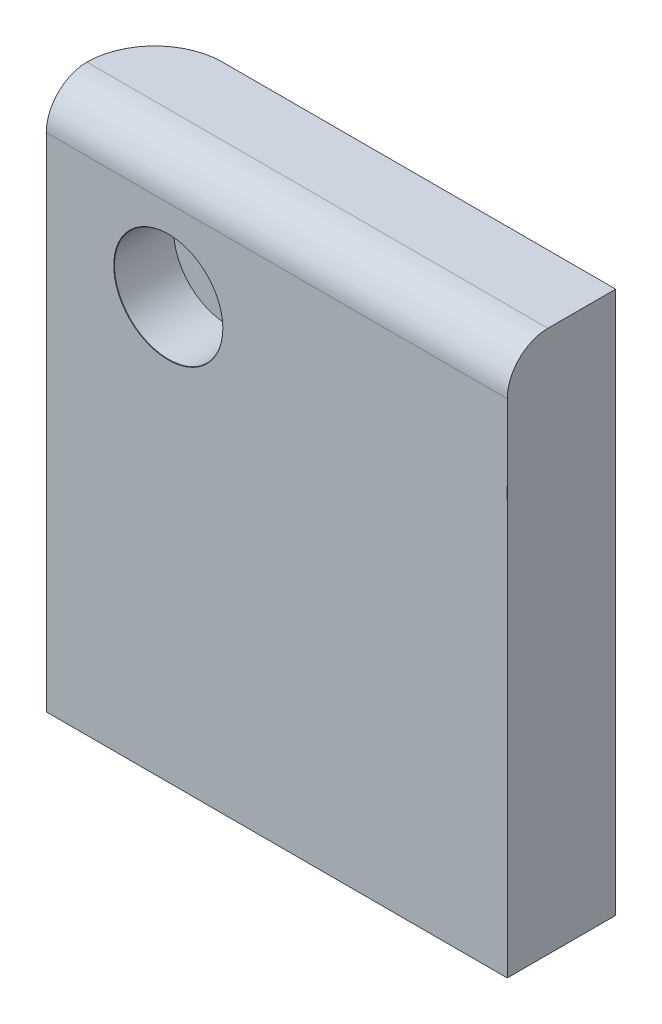
ISO-10303-21;
HEADER;
FILE_DESCRIPTION(('STEP AP214'),'2;1');
FILE_NAME('part.step','',(''),(''),'','','');
FILE_SCHEMA(('AUTOMOTIVE_DESIGN { 1 0 10303 214 1 1 1 1 }'));
ENDSEC;
DATA;
#1=APPLICATION_CONTEXT('core data for automotive mechanical design processes');
#2=APPLICATION_PROTOCOL_DEFINITION('international standard','automotive_design',2000,#1);
#3=PRODUCT_CONTEXT('',#1,'mechanical');
#4=PRODUCT('Part','Part','',(#3));
#5=PRODUCT_RELATED_PRODUCT_CATEGORY('part','',(#4));
#6=PRODUCT_DEFINITION_FORMATION('','',#4);
#7=PRODUCT_DEFINITION_CONTEXT('part definition',#1,'design');
#8=PRODUCT_DEFINITION('design','',#6,#7);
#9=PRODUCT_DEFINITION_SHAPE('','',#8);
#10=(LENGTH_UNIT() NAMED_UNIT(*) SI_UNIT(.MILLI.,.METRE.));
#11=(NAMED_UNIT(*) PLANE_ANGLE_UNIT() SI_UNIT($,.RADIAN.));
#12=(NAMED_UNIT(*) SI_UNIT($,.STERADIAN.) SOLID_ANGLE_UNIT());
#13=UNCERTAINTY_MEASURE_WITH_UNIT(LENGTH_MEASURE(1.E-05),#10,'distance_accuracy_value','');
#14=(GEOMETRIC_REPRESENTATION_CONTEXT(3) GLOBAL_UNCERTAINTY_ASSIGNED_CONTEXT((#13)) GLOBAL_UNIT_ASSIGNED_CONTEXT((#10,
#11,#12)) REPRESENTATION_CONTEXT('',''));
#15=CARTESIAN_POINT('',(0.,0.,0.));
#16=DIRECTION('',(0.,0.,1.));
#17=DIRECTION('',(1.,0.,0.));
#18=AXIS2_PLACEMENT_3D('',#15,#16,#17);
#19=CARTESIAN_POINT('',(-23.5,-40.,4.));
#20=DIRECTION('',(0.,0.,1.));
#21=DIRECTION('',(1.,0.,0.));
#22=AXIS2_PLACEMENT_3D('',#19,#20,#21);
#23=PLANE('',#22);
#24=DIRECTION('',(0.,-1.,0.));
#25=VECTOR('',#24,1.);
#26=CARTESIAN_POINT('',(10.5,-40.,4.));
#27=LINE('',#26,#25);
#28=CARTESIAN_POINT('',(10.5,-3.,4.));
#29=VERTEX_POINT('',#28);
#30=CARTESIAN_POINT('',(10.5,-8.55208817832078,4.));
#31=VERTEX_POINT('',#30);
#32=EDGE_CURVE('E62',#29,#31,#27,.T.);
#33=ORIENTED_EDGE('',*,*,#32,.F.);
#34=DIRECTION('',(1.,0.,0.));
#35=VECTOR('',#34,1.);
#36=CARTESIAN_POINT('',(-23.5,-3.,4.));
#37=LINE('',#36,#35);
#38=CARTESIAN_POINT('',(-23.5,-3.,4.));
#39=VERTEX_POINT('',#38);
#40=EDGE_CURVE('E137',#29,#39,#37,.F.);
#41=ORIENTED_EDGE('',*,*,#40,.T.);
#42=DIRECTION('',(0.,1.,0.));
#43=VECTOR('',#42,1.);
#44=CARTESIAN_POINT('',(-23.5,-40.,4.));
#45=LINE('',#44,#43);
#46=CARTESIAN_POINT('',(-23.5,-40.,4.));
#47=VERTEX_POINT('',#46);
#48=EDGE_CURVE('E124',#47,#39,#45,.T.);
#49=ORIENTED_EDGE('',*,*,#48,.F.);
#50=DIRECTION('',(1.,0.,0.));
#51=VECTOR('',#50,1.);
#52=CARTESIAN_POINT('',(-23.5,-40.,4.));
#53=LINE('',#52,#51);
#54=CARTESIAN_POINT('',(10.5,-40.,4.));
#55=VERTEX_POINT('',#54);
#56=EDGE_CURVE('E115',#47,#55,#53,.T.);
#57=ORIENTED_EDGE('',*,*,#56,.T.);
#58=CARTESIAN_POINT('',(10.5,-9.44791182167922,4.));
#59=VERTEX_POINT('',#58);
#60=EDGE_CURVE('E101',#59,#55,#27,.T.);
#61=ORIENTED_EDGE('',*,*,#60,.F.);
#62=CARTESIAN_POINT('',(14.5,-9.,4.));
#63=DIRECTION('',(0.,0.,1.));
#64=DIRECTION('',(1.,0.,0.));
#65=AXIS2_PLACEMENT_3D('',#62,#63,#64);
#66=CIRCLE('',#65,4.025);
#67=EDGE_CURVE('E133',#31,#59,#66,.T.);
#68=ORIENTED_EDGE('',*,*,#67,.F.);
#69=EDGE_LOOP('',(#33,#41,#49,#57,#61,#68));
#70=FACE_BOUND('',#69,.T.);
#71=CARTESIAN_POINT('',(-14.5,-9.,4.));
#72=DIRECTION('',(0.,0.,1.));
#73=DIRECTION('',(1.,0.,0.));
#74=AXIS2_PLACEMENT_3D('',#71,#72,#73);
#75=CIRCLE('',#74,4.025);
#76=CARTESIAN_POINT('',(-10.475,-9.,4.));
#77=VERTEX_POINT('',#76);
#78=EDGE_CURVE('E168',#77,#77,#75,.T.);
#79=ORIENTED_EDGE('',*,*,#78,.F.);
#80=EDGE_LOOP('',(#79));
#81=FACE_BOUND('',#80,.T.);
#82=ADVANCED_FACE('F41',(#70,#81),#23,.T.);
#83=CARTESIAN_POINT('',(-23.5,-40.,4.));
#84=DIRECTION('',(-1.,0.,0.));
#85=DIRECTION('',(0.,0.,1.));
#86=AXIS2_PLACEMENT_3D('',#83,#84,#85);
#87=PLANE('',#86);
#88=CARTESIAN_POINT('',(-23.5,-3.,0.999999999999999));
#89=DIRECTION('',(-1.,0.,0.));
#90=DIRECTION('',(0.,0.,1.));
#91=AXIS2_PLACEMENT_3D('',#88,#89,#90);
#92=CIRCLE('',#91,3.);
#93=CARTESIAN_POINT('',(-23.5,0.,0.999999999999999));
#94=VERTEX_POINT('',#93);
#95=EDGE_CURVE('E139',#39,#94,#92,.T.);
#96=ORIENTED_EDGE('',*,*,#95,.T.);
#97=DIRECTION('',(0.,1.,0.));
#98=VECTOR('',#97,1.);
#99=CARTESIAN_POINT('',(-23.5,-40.,0.999999999999999));
#100=LINE('',#99,#98);
#101=CARTESIAN_POINT('',(-23.5,-40.,0.999999999999999));
#102=VERTEX_POINT('',#101);
#103=EDGE_CURVE('E69',#94,#102,#100,.F.);
#104=ORIENTED_EDGE('',*,*,#103,.T.);
#105=DIRECTION('',(0.,0.,1.));
#106=VECTOR('',#105,1.);
#107=CARTESIAN_POINT('',(-23.5,-40.,4.));
#108=LINE('',#107,#106);
#109=EDGE_CURVE('E125',#102,#47,#108,.T.);
#110=ORIENTED_EDGE('',*,*,#109,.T.);
#111=ORIENTED_EDGE('',*,*,#48,.T.);
#112=EDGE_LOOP('',(#96,#104,#110,#111));
#113=FACE_BOUND('',#112,.T.);
#114=ADVANCED_FACE('F181',(#113),#87,.T.);
#115=CARTESIAN_POINT('',(-23.5,-40.,-4.));
#116=DIRECTION('',(0.,0.,-1.));
#117=DIRECTION('',(-1.,0.,0.));
#118=AXIS2_PLACEMENT_3D('',#115,#116,#117);
#119=PLANE('',#118);
#120=DIRECTION('',(0.,-1.,0.));
#121=VECTOR('',#120,1.);
#122=CARTESIAN_POINT('',(10.5,-40.,-4.));
#123=LINE('',#122,#121);
#124=CARTESIAN_POINT('',(10.5,0.,-4.));
#125=VERTEX_POINT('',#124);
#126=CARTESIAN_POINT('',(10.5,-40.,-4.));
#127=VERTEX_POINT('',#126);
#128=EDGE_CURVE('E119',#125,#127,#123,.T.);
#129=ORIENTED_EDGE('',*,*,#128,.T.);
#130=DIRECTION('',(-1.,0.,0.));
#131=VECTOR('',#130,1.);
#132=CARTESIAN_POINT('',(-23.5,-40.,-4.));
#133=LINE('',#132,#131);
#134=CARTESIAN_POINT('',(-18.5,-40.,-4.));
#135=VERTEX_POINT('',#134);
#136=EDGE_CURVE('E117',#127,#135,#133,.T.);
#137=ORIENTED_EDGE('',*,*,#136,.T.);
#138=DIRECTION('',(0.,1.,0.));
#139=VECTOR('',#138,1.);
#140=CARTESIAN_POINT('',(-18.5,-40.,-4.));
#141=LINE('',#140,#139);
#142=CARTESIAN_POINT('',(-18.5,0.,-4.));
#143=VERTEX_POINT('',#142);
#144=EDGE_CURVE('E141',#135,#143,#141,.T.);
#145=ORIENTED_EDGE('',*,*,#144,.T.);
#146=DIRECTION('',(-1.,0.,0.));
#147=VECTOR('',#146,1.);
#148=CARTESIAN_POINT('',(-23.5,0.,-4.));
#149=LINE('',#148,#147);
#150=EDGE_CURVE('E132',#125,#143,#149,.T.);
#151=ORIENTED_EDGE('',*,*,#150,.F.);
#152=EDGE_LOOP('',(#129,#137,#145,#151));
#153=FACE_BOUND('',#152,.T.);
#154=CARTESIAN_POINT('',(-14.5,-9.,-4.));
#155=DIRECTION('',(0.,0.,1.));
#156=DIRECTION('',(1.,0.,0.));
#157=AXIS2_PLACEMENT_3D('',#154,#155,#156);
#158=CIRCLE('',#157,2.15);
#159=CARTESIAN_POINT('',(-12.35,-9.,-4.));
#160=VERTEX_POINT('',#159);
#161=EDGE_CURVE('E156',#160,#160,#158,.T.);
#162=ORIENTED_EDGE('',*,*,#161,.T.);
#163=EDGE_LOOP('',(#162));
#164=FACE_BOUND('',#163,.T.);
#165=ADVANCED_FACE('F152',(#153,#164),#119,.T.);
#166=CARTESIAN_POINT('',(0.,-40.,0.));
#167=DIRECTION('',(0.,-1.,0.));
#168=DIRECTION('',(0.,0.,-1.));
#169=AXIS2_PLACEMENT_3D('',#166,#167,#168);
#170=PLANE('',#169);
#171=DIRECTION('',(0.,0.,1.));
#172=VECTOR('',#171,1.);
#173=CARTESIAN_POINT('',(10.5,-40.,-4.001));
#174=LINE('',#173,#172);
#175=EDGE_CURVE('E104',#127,#55,#174,.T.);
#176=ORIENTED_EDGE('',*,*,#175,.T.);
#177=ORIENTED_EDGE('',*,*,#56,.F.);
#178=ORIENTED_EDGE('',*,*,#109,.F.);
#179=CARTESIAN_POINT('',(-18.5,-40.,0.999999999999999));
#180=DIRECTION('',(0.,-1.,0.));
#181=DIRECTION('',(0.,0.,-1.));
#182=AXIS2_PLACEMENT_3D('',#179,#180,#181);
#183=CIRCLE('',#182,5.);
#184=EDGE_CURVE('E55',#102,#135,#183,.T.);
#185=ORIENTED_EDGE('',*,*,#184,.T.);
#186=ORIENTED_EDGE('',*,*,#136,.F.);
#187=EDGE_LOOP('',(#176,#177,#178,#185,#186));
#188=FACE_BOUND('',#187,.T.);
#189=ADVANCED_FACE('F114',(#188),#170,.T.);
#190=CARTESIAN_POINT('',(0.,0.,0.));
#191=DIRECTION('',(0.,-1.,0.));
#192=DIRECTION('',(0.,0.,-1.));
#193=AXIS2_PLACEMENT_3D('',#190,#191,#192);
#194=PLANE('',#193);
#195=DIRECTION('',(1.,0.,0.));
#196=VECTOR('',#195,1.);
#197=CARTESIAN_POINT('',(23.5,0.,0.999999999999999));
#198=LINE('',#197,#196);
#199=CARTESIAN_POINT('',(10.5,0.,0.999999999999999));
#200=VERTEX_POINT('',#199);
#201=EDGE_CURVE('E127',#94,#200,#198,.T.);
#202=ORIENTED_EDGE('',*,*,#201,.T.);
#203=DIRECTION('',(0.,0.,-1.));
#204=VECTOR('',#203,1.);
#205=CARTESIAN_POINT('',(10.5,0.,0.));
#206=LINE('',#205,#204);
#207=EDGE_CURVE('E171',#200,#125,#206,.T.);
#208=ORIENTED_EDGE('',*,*,#207,.T.);
#209=ORIENTED_EDGE('',*,*,#150,.T.);
#210=CARTESIAN_POINT('',(-18.5,0.,0.999999999999999));
#211=DIRECTION('',(0.,-1.,0.));
#212=DIRECTION('',(0.,0.,-1.));
#213=AXIS2_PLACEMENT_3D('',#210,#211,#212);
#214=CIRCLE('',#213,5.);
#215=EDGE_CURVE('E144',#143,#94,#214,.F.);
#216=ORIENTED_EDGE('',*,*,#215,.T.);
#217=EDGE_LOOP('',(#202,#208,#209,#216));
#218=FACE_BOUND('',#217,.T.);
#219=ADVANCED_FACE('F193',(#218),#194,.F.);
#220=CARTESIAN_POINT('',(0.,-3.,0.999999999999999));
#221=DIRECTION('',(-1.,0.,0.));
#222=DIRECTION('',(0.,0.,1.));
#223=AXIS2_PLACEMENT_3D('',#220,#221,#222);
#224=CYLINDRICAL_SURFACE('',#223,3.);
#225=CARTESIAN_POINT('',(10.5,-3.,0.999999999999999));
#226=DIRECTION('',(-1.,0.,0.));
#227=DIRECTION('',(0.,-1.,0.));
#228=AXIS2_PLACEMENT_3D('',#225,#226,#227);
#229=CIRCLE('',#228,3.);
#230=EDGE_CURVE('E118',#200,#29,#229,.F.);
#231=ORIENTED_EDGE('',*,*,#230,.F.);
#232=ORIENTED_EDGE('',*,*,#201,.F.);
#233=ORIENTED_EDGE('',*,*,#95,.F.);
#234=ORIENTED_EDGE('',*,*,#40,.F.);
#235=EDGE_LOOP('',(#231,#232,#233,#234));
#236=FACE_BOUND('',#235,.T.);
#237=ADVANCED_FACE('F180',(#236),#224,.T.);
#238=CARTESIAN_POINT('',(-18.5,-40.,0.999999999999999));
#239=DIRECTION('',(0.,1.,0.));
#240=DIRECTION('',(0.,0.,1.));
#241=AXIS2_PLACEMENT_3D('',#238,#239,#240);
#242=CYLINDRICAL_SURFACE('',#241,5.);
#243=ORIENTED_EDGE('',*,*,#184,.F.);
#244=ORIENTED_EDGE('',*,*,#103,.F.);
#245=ORIENTED_EDGE('',*,*,#215,.F.);
#246=ORIENTED_EDGE('',*,*,#144,.F.);
#247=EDGE_LOOP('',(#243,#244,#245,#246));
#248=FACE_BOUND('',#247,.T.);
#249=ADVANCED_FACE('F43',(#248),#242,.T.);
#250=CARTESIAN_POINT('',(14.5,-9.,4.));
#251=DIRECTION('',(0.,0.,1.));
#252=DIRECTION('',(1.,0.,0.));
#253=AXIS2_PLACEMENT_3D('',#250,#251,#252);
#254=CONICAL_SURFACE('',#253,4.025,0.785398163397431);
#255=ORIENTED_EDGE('',*,*,#67,.T.);
#256=CARTESIAN_POINT('',(10.5,-20.3934802652555,12.0502388197822));
#257=CARTESIAN_POINT('',(10.5,-20.2109607038713,11.8780276741898));
#258=CARTESIAN_POINT('',(10.5,-20.0282180718648,11.7060527414753));
#259=CARTESIAN_POINT('',(10.5,-19.6622112646299,11.3626566688936));
#260=CARTESIAN_POINT('',(10.5,-19.4789470863176,11.1912355323138));
#261=CARTESIAN_POINT('',(10.5,-18.9279332900011,10.6776211775315));
#262=CARTESIAN_POINT('',(10.5,-18.5592893623036,10.3363860490186));
#263=CARTESIAN_POINT('',(10.5,-17.8066687100647,9.64629682916429));
#264=CARTESIAN_POINT('',(10.5,-17.4225850688015,9.29755894311776));
#265=CARTESIAN_POINT('',(10.5,-16.8429588535663,8.77867416451259));
#266=CARTESIAN_POINT('',(10.5,-16.6492453200522,8.60648469656374));
#267=CARTESIAN_POINT('',(10.5,-16.26033678603,8.26378830886563));
#268=CARTESIAN_POINT('',(10.5,-16.06514179902,8.09328137381859));
#269=CARTESIAN_POINT('',(10.5,-15.6731271676605,7.75451829140357));
#270=CARTESIAN_POINT('',(10.5,-15.4763092295248,7.58626017259951));
#271=CARTESIAN_POINT('',(10.5,-15.0804296479905,7.25238285612656));
#272=CARTESIAN_POINT('',(10.5,-14.8813679168238,7.08676376230143));
#273=CARTESIAN_POINT('',(10.5,-14.479912348523,6.75851202117994));
#274=CARTESIAN_POINT('',(10.5,-14.2775111073725,6.59588840332715));
#275=CARTESIAN_POINT('',(10.5,-13.8691464870581,6.27520521686326));
#276=CARTESIAN_POINT('',(10.5,-13.6631835185297,6.11714512765378));
#277=CARTESIAN_POINT('',(10.5,-13.249654881061,5.8094439133787));
#278=CARTESIAN_POINT('',(10.5,-13.0421556241919,5.65971401176309));
#279=CARTESIAN_POINT('',(10.5,-12.6212105185816,5.36851601725246));
#280=CARTESIAN_POINT('',(10.5,-12.4077614627194,5.22705251256106));
#281=CARTESIAN_POINT('',(10.5,-11.9742927127573,4.95674518961489));
#282=CARTESIAN_POINT('',(10.5,-11.7543073370354,4.82784687638187));
#283=CARTESIAN_POINT('',(10.5,-11.3050021862701,4.5877018571661));
#284=CARTESIAN_POINT('',(10.5,-11.0756962424415,4.4764301154277));
#285=CARTESIAN_POINT('',(10.5,-10.721308574567,4.32829461259404));
#286=CARTESIAN_POINT('',(10.5,-10.6002983458952,4.28171174496377));
#287=CARTESIAN_POINT('',(10.5,-10.355340512541,4.19681690987013));
#288=CARTESIAN_POINT('',(10.5,-10.2313922472587,4.15850682244863));
#289=CARTESIAN_POINT('',(10.5,-9.98154535469892,4.09192040527695));
#290=CARTESIAN_POINT('',(10.5,-9.85566173446114,4.06358851966438));
#291=CARTESIAN_POINT('',(10.5,-9.60187270317381,4.01810297923245));
#292=CARTESIAN_POINT('',(10.5,-9.47396753180646,4.00094800927208));
#293=CARTESIAN_POINT('',(10.5,-9.21572650756436,3.97872672310647));
#294=CARTESIAN_POINT('',(10.5,-9.08537925527957,3.97379022313184));
#295=CARTESIAN_POINT('',(10.5,-8.82483748150653,3.9767135756632));
#296=CARTESIAN_POINT('',(10.5,-8.69464295390871,3.98457289751506));
#297=CARTESIAN_POINT('',(10.5,-8.43508321561211,4.01262389276748));
#298=CARTESIAN_POINT('',(10.5,-8.30572343229864,4.03286494675066));
#299=CARTESIAN_POINT('',(10.5,-8.04926230232541,4.08451357518027));
#300=CARTESIAN_POINT('',(10.5,-7.9221615536368,4.11592406130471));
#301=CARTESIAN_POINT('',(10.5,-7.61361074254691,4.20482371694392));
#302=CARTESIAN_POINT('',(10.5,-7.43371378155053,4.26767719100208));
#303=CARTESIAN_POINT('',(10.5,-7.08014208665503,4.40890293811945));
#304=CARTESIAN_POINT('',(10.5,-6.90647163615894,4.48728566115413));
#305=CARTESIAN_POINT('',(10.5,-6.64939852948463,4.61393462918286));
#306=CARTESIAN_POINT('',(10.5,-6.56383985740139,4.65791853978408));
#307=CARTESIAN_POINT('',(10.5,-6.39407679064292,4.74843406190199));
#308=CARTESIAN_POINT('',(10.5,-6.30987241301953,4.7949657054646));
#309=CARTESIAN_POINT('',(10.5,-6.14275001898031,4.89019725574222));
#310=CARTESIAN_POINT('',(10.5,-6.05983148521158,4.93889625821456));
#311=CARTESIAN_POINT('',(10.5,-5.89514226460954,5.0381841922812));
#312=CARTESIAN_POINT('',(10.5,-5.813371523475,5.08877303405121));
#313=CARTESIAN_POINT('',(10.5,-5.53328173556527,5.26596790526022));
#314=CARTESIAN_POINT('',(10.5,-5.33753382597596,5.3966449587549));
#315=CARTESIAN_POINT('',(10.5,-4.95087640936165,5.66499833597696));
#316=CARTESIAN_POINT('',(10.5,-4.75996823282242,5.80267655377904));
#317=CARTESIAN_POINT('',(10.5,-4.38182026484095,6.08331569764384));
#318=CARTESIAN_POINT('',(10.5,-4.19458395350738,6.22628129663775));
#319=CARTESIAN_POINT('',(10.5,-3.823185140634,6.51609666266586));
#320=CARTESIAN_POINT('',(10.5,-3.63902233199609,6.66294603780524));
#321=CARTESIAN_POINT('',(10.5,-3.27244400746702,6.96022398919891));
#322=CARTESIAN_POINT('',(10.5,-3.09003788086854,7.11066411632884));
#323=CARTESIAN_POINT('',(10.5,-2.72722562793137,7.41393942597095));
#324=CARTESIAN_POINT('',(10.5,-2.54681954429029,7.56677465944721));
#325=CARTESIAN_POINT('',(10.5,-2.00822745022476,8.02796753543493));
#326=CARTESIAN_POINT('',(10.5,-1.65247732088779,8.33916843845323));
#327=CARTESIAN_POINT('',(10.5,-0.985060296988945,8.93148008465614));
#328=CARTESIAN_POINT('',(10.5,-0.672917832292812,9.21205808676713));
#329=CARTESIAN_POINT('',(10.5,-0.0512448160528349,9.77618122742155));
#330=CARTESIAN_POINT('',(10.5,0.258285350394677,10.0597267900936));
#331=CARTESIAN_POINT('',(10.5,0.87299579995099,10.6268572613379));
#332=CARTESIAN_POINT('',(10.5,1.17819128198266,10.9104257274001));
#333=CARTESIAN_POINT('',(10.5,1.78694611014208,11.47920407631));
#334=CARTESIAN_POINT('',(10.5,2.0905057426696,11.7644136524768));
#335=CARTESIAN_POINT('',(10.5,2.39348026525555,12.0502388197822));
#336=B_SPLINE_CURVE_WITH_KNOTS('',3,(#256,#257,#258,#259,#260,#261,#262,#263,#264,#265,#266,
#267,#268,#269,#270,#271,#272,#273,#274,#275,#276,#277,#278,#279,#280,#281,#282,#283,#284,#285,
#286,#287,#288,#289,#290,#291,#292,#293,#294,#295,#296,#297,#298,#299,#300,#301,#302,#303,#304,
#305,#306,#307,#308,#309,#310,#311,#312,#313,#314,#315,#316,#317,#318,#319,#320,#321,#322,#323,
#324,#325,#326,#327,#328,#329,#330,#331,#332,#333,#334,#335),.UNSPECIFIED.,.F.,.F.,(4,2,2,2,2,2,
2,2,2,2,2,2,2,2,2,2,2,2,2,2,2,2,2,2,2,2,2,2,2,2,2,2,2,2,2,2,2,2,2,4),(0.,0.752815027245768,
1.50563451499077,3.0126231292286,4.56893802274741,5.34646988174885,6.12399466481175,
6.90078601371739,7.67760785370901,8.45647867745135,9.23526029522824,10.002763032128,
10.7706877967568,11.535118229046,12.298452980678,12.6872159157786,13.0760671069662,
13.4627177211862,13.8493228316224,14.2400181622882,14.6306972908833,15.022944769629,
15.4152945755672,15.9859650024226,16.5570207584096,16.8455932668903,17.13416940593,
17.4226262566879,17.7110694144549,18.4168999608653,19.1229224871967,19.8295846431092,
20.5361757628686,21.2454721634463,21.9547836772827,23.3726685652087,24.631781313202,
25.8910765422164,27.1408691522943,28.3904353388268),.UNSPECIFIED.);
#337=EDGE_CURVE('E11',#59,#31,#336,.T.);
#338=ORIENTED_EDGE('',*,*,#337,.T.);
#339=EDGE_LOOP('',(#255,#338));
#340=FACE_BOUND('',#339,.T.);
#341=ADVANCED_FACE('F198',(#340),#254,.F.);
#342=CARTESIAN_POINT('',(-14.5,-9.,4.));
#343=DIRECTION('',(0.,0.,1.));
#344=DIRECTION('',(1.,0.,0.));
#345=AXIS2_PLACEMENT_3D('',#342,#343,#344);
#346=CYLINDRICAL_SURFACE('',#345,2.15);
#347=ORIENTED_EDGE('',*,*,#161,.F.);
#348=EDGE_LOOP('',(#347));
#349=FACE_BOUND('',#348,.T.);
#350=CARTESIAN_POINT('',(-14.5,-9.,-0.400000000000001));
#351=DIRECTION('',(0.,0.,1.));
#352=DIRECTION('',(1.,0.,0.));
#353=AXIS2_PLACEMENT_3D('',#350,#351,#352);
#354=CIRCLE('',#353,2.15);
#355=CARTESIAN_POINT('',(-12.35,-9.,-0.400000000000001));
#356=VERTEX_POINT('',#355);
#357=EDGE_CURVE('E159',#356,#356,#354,.T.);
#358=ORIENTED_EDGE('',*,*,#357,.T.);
#359=EDGE_LOOP('',(#358));
#360=FACE_BOUND('',#359,.T.);
#361=ADVANCED_FACE('F206',(#349,#360),#346,.F.);
#362=CARTESIAN_POINT('',(-10.5,-9.,-0.400000000000001));
#363=DIRECTION('',(0.,0.,-1.));
#364=DIRECTION('',(-1.,0.,0.));
#365=AXIS2_PLACEMENT_3D('',#362,#363,#364);
#366=PLANE('',#365);
#367=ORIENTED_EDGE('',*,*,#357,.F.);
#368=EDGE_LOOP('',(#367));
#369=FACE_BOUND('',#368,.T.);
#370=CARTESIAN_POINT('',(-14.5,-9.,-0.400000000000001));
#371=DIRECTION('',(0.,0.,1.));
#372=DIRECTION('',(1.,0.,0.));
#373=AXIS2_PLACEMENT_3D('',#370,#371,#372);
#374=CIRCLE('',#373,4.);
#375=CARTESIAN_POINT('',(-10.5,-9.,-0.400000000000001));
#376=VERTEX_POINT('',#375);
#377=EDGE_CURVE('E162',#376,#376,#374,.T.);
#378=ORIENTED_EDGE('',*,*,#377,.T.);
#379=EDGE_LOOP('',(#378));
#380=FACE_BOUND('',#379,.T.);
#381=ADVANCED_FACE('F210',(#369,#380),#366,.F.);
#382=CARTESIAN_POINT('',(-14.5,-9.,4.));
#383=DIRECTION('',(0.,0.,1.));
#384=DIRECTION('',(1.,0.,0.));
#385=AXIS2_PLACEMENT_3D('',#382,#383,#384);
#386=CYLINDRICAL_SURFACE('',#385,4.);
#387=ORIENTED_EDGE('',*,*,#377,.F.);
#388=EDGE_LOOP('',(#387));
#389=FACE_BOUND('',#388,.T.);
#390=CARTESIAN_POINT('',(-14.5,-9.,3.975));
#391=DIRECTION('',(0.,0.,1.));
#392=DIRECTION('',(1.,0.,0.));
#393=AXIS2_PLACEMENT_3D('',#390,#391,#392);
#394=CIRCLE('',#393,4.);
#395=CARTESIAN_POINT('',(-10.5,-9.,3.975));
#396=VERTEX_POINT('',#395);
#397=EDGE_CURVE('E165',#396,#396,#394,.T.);
#398=ORIENTED_EDGE('',*,*,#397,.T.);
#399=EDGE_LOOP('',(#398));
#400=FACE_BOUND('',#399,.T.);
#401=ADVANCED_FACE('F214',(#389,#400),#386,.F.);
#402=CARTESIAN_POINT('',(-14.5,-9.,4.));
#403=DIRECTION('',(0.,0.,1.));
#404=DIRECTION('',(1.,0.,0.));
#405=AXIS2_PLACEMENT_3D('',#402,#403,#404);
#406=CONICAL_SURFACE('',#405,4.025,0.785398163397466);
#407=ORIENTED_EDGE('',*,*,#397,.F.);
#408=EDGE_LOOP('',(#407));
#409=FACE_BOUND('',#408,.T.);
#410=ORIENTED_EDGE('',*,*,#78,.T.);
#411=EDGE_LOOP('',(#410));
#412=FACE_BOUND('',#411,.T.);
#413=ADVANCED_FACE('F218',(#409,#412),#406,.F.);
#414=CARTESIAN_POINT('',(10.5,-40.,-4.001));
#415=DIRECTION('',(-1.,0.,0.));
#416=DIRECTION('',(0.,-1.,0.));
#417=AXIS2_PLACEMENT_3D('',#414,#415,#416);
#418=PLANE('',#417);
#419=ORIENTED_EDGE('',*,*,#230,.T.);
#420=ORIENTED_EDGE('',*,*,#32,.T.);
#421=ORIENTED_EDGE('',*,*,#337,.F.);
#422=ORIENTED_EDGE('',*,*,#60,.T.);
#423=ORIENTED_EDGE('',*,*,#175,.F.);
#424=ORIENTED_EDGE('',*,*,#128,.F.);
#425=ORIENTED_EDGE('',*,*,#207,.F.);
#426=EDGE_LOOP('',(#419,#420,#421,#422,#423,#424,#425));
#427=FACE_BOUND('',#426,.T.);
#428=ADVANCED_FACE('F103',(#427),#418,.F.);
#429=CLOSED_SHELL('',(#82,#114,#165,#189,#219,#237,#249,#341,#361,#381,#401,#413,#428));
#430=MANIFOLD_SOLID_BREP('B2',#429);
#431=ADVANCED_BREP_SHAPE_REPRESENTATION('',(#18,#430),#14);
#432=SHAPE_DEFINITION_REPRESENTATION(#9,#431);
ENDSEC;
END-ISO-10303-21;
